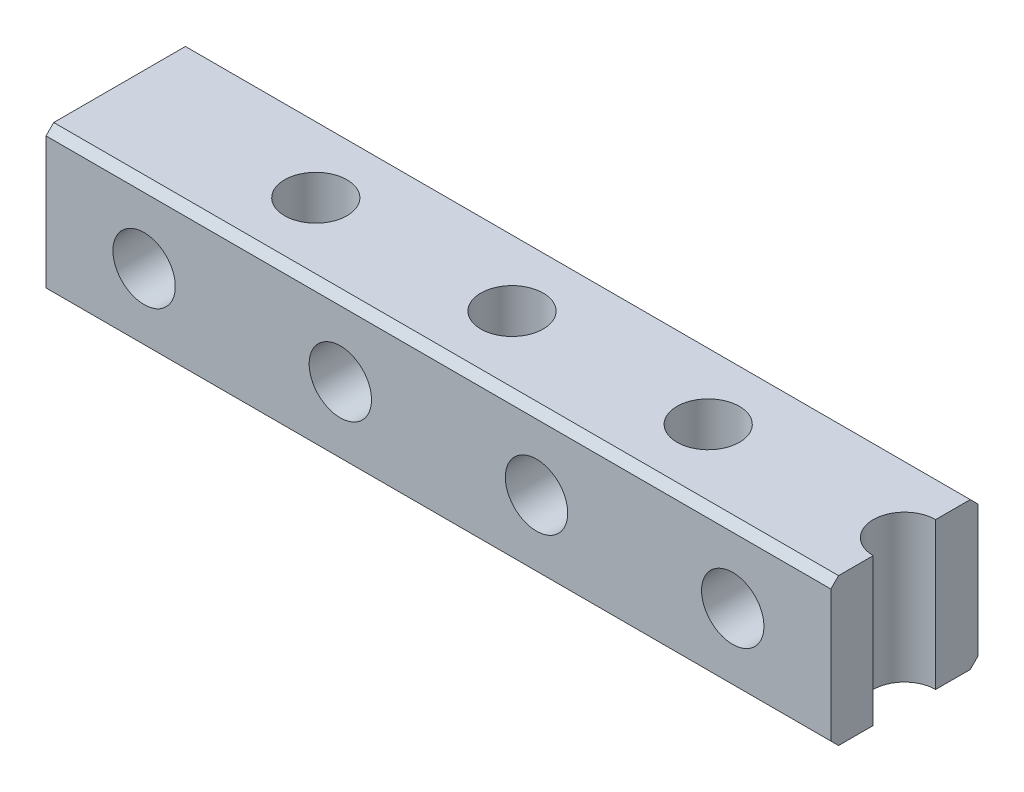
ISO-10303-21;
HEADER;
FILE_DESCRIPTION(('STEP AP214'),'2;1');
FILE_NAME('part.step','',(''),(''),'','','');
FILE_SCHEMA(('AUTOMOTIVE_DESIGN { 1 0 10303 214 1 1 1 1 }'));
ENDSEC;
DATA;
#1=APPLICATION_CONTEXT('core data for automotive mechanical design processes');
#2=APPLICATION_PROTOCOL_DEFINITION('international standard','automotive_design',2000,#1);
#3=PRODUCT_CONTEXT('',#1,'mechanical');
#4=PRODUCT('Part','Part','',(#3));
#5=PRODUCT_RELATED_PRODUCT_CATEGORY('part','',(#4));
#6=PRODUCT_DEFINITION_FORMATION('','',#4);
#7=PRODUCT_DEFINITION_CONTEXT('part definition',#1,'design');
#8=PRODUCT_DEFINITION('design','',#6,#7);
#9=PRODUCT_DEFINITION_SHAPE('','',#8);
#10=(LENGTH_UNIT() NAMED_UNIT(*) SI_UNIT(.MILLI.,.METRE.));
#11=(NAMED_UNIT(*) PLANE_ANGLE_UNIT() SI_UNIT($,.RADIAN.));
#12=(NAMED_UNIT(*) SI_UNIT($,.STERADIAN.) SOLID_ANGLE_UNIT());
#13=UNCERTAINTY_MEASURE_WITH_UNIT(LENGTH_MEASURE(1.E-05),#10,'distance_accuracy_value','');
#14=(GEOMETRIC_REPRESENTATION_CONTEXT(3) GLOBAL_UNCERTAINTY_ASSIGNED_CONTEXT((#13)) GLOBAL_UNIT_ASSIGNED_CONTEXT((#10,
#11,#12)) REPRESENTATION_CONTEXT('',''));
#15=CARTESIAN_POINT('',(0.,0.,0.));
#16=DIRECTION('',(0.,0.,1.));
#17=DIRECTION('',(1.,0.,0.));
#18=AXIS2_PLACEMENT_3D('',#15,#16,#17);
#19=CARTESIAN_POINT('',(25.4,0.,0.));
#20=DIRECTION('',(1.,0.,0.));
#21=DIRECTION('',(0.,1.,0.));
#22=AXIS2_PLACEMENT_3D('',#19,#20,#21);
#23=PLANE('',#22);
#24=DIRECTION('',(0.,1.,0.));
#25=VECTOR('',#24,1.);
#26=CARTESIAN_POINT('',(25.4,-4.7625,2.0193));
#27=LINE('',#26,#25);
#28=CARTESIAN_POINT('',(25.4,4.7625,2.0193));
#29=VERTEX_POINT('',#28);
#30=CARTESIAN_POINT('',(25.4,-4.7625,2.0193));
#31=VERTEX_POINT('',#30);
#32=EDGE_CURVE('E11',#29,#31,#27,.F.);
#33=ORIENTED_EDGE('',*,*,#32,.F.);
#34=DIRECTION('',(0.,0.,-1.));
#35=VECTOR('',#34,1.);
#36=CARTESIAN_POINT('',(25.4,4.7625,-2.13125));
#37=LINE('',#36,#35);
#38=CARTESIAN_POINT('',(25.4,4.7625,4.2625));
#39=VERTEX_POINT('',#38);
#40=EDGE_CURVE('E211',#39,#29,#37,.T.);
#41=ORIENTED_EDGE('',*,*,#40,.F.);
#42=DIRECTION('',(0.,0.707106781186548,-0.707106781186547));
#43=VECTOR('',#42,1.);
#44=CARTESIAN_POINT('',(25.4,4.5125,4.5125));
#45=LINE('',#44,#43);
#46=CARTESIAN_POINT('',(25.4,4.2625,4.7625));
#47=VERTEX_POINT('',#46);
#48=EDGE_CURVE('E207',#47,#39,#45,.T.);
#49=ORIENTED_EDGE('',*,*,#48,.F.);
#50=DIRECTION('',(0.,1.,0.));
#51=VECTOR('',#50,1.);
#52=CARTESIAN_POINT('',(25.4,2.13125,4.7625));
#53=LINE('',#52,#51);
#54=CARTESIAN_POINT('',(25.4,-4.2625,4.7625));
#55=VERTEX_POINT('',#54);
#56=EDGE_CURVE('E203',#55,#47,#53,.T.);
#57=ORIENTED_EDGE('',*,*,#56,.F.);
#58=DIRECTION('',(0.,0.707106781186547,0.707106781186548));
#59=VECTOR('',#58,1.);
#60=CARTESIAN_POINT('',(25.4,-4.5125,4.5125));
#61=LINE('',#60,#59);
#62=CARTESIAN_POINT('',(25.4,-4.7625,4.2625));
#63=VERTEX_POINT('',#62);
#64=EDGE_CURVE('E199',#63,#55,#61,.T.);
#65=ORIENTED_EDGE('',*,*,#64,.F.);
#66=DIRECTION('',(0.,0.,1.));
#67=VECTOR('',#66,1.);
#68=CARTESIAN_POINT('',(25.4,-4.7625,2.13125));
#69=LINE('',#68,#67);
#70=EDGE_CURVE('E198',#31,#63,#69,.T.);
#71=ORIENTED_EDGE('',*,*,#70,.F.);
#72=EDGE_LOOP('',(#33,#41,#49,#57,#65,#71));
#73=FACE_BOUND('',#72,.T.);
#74=ADVANCED_FACE('F17',(#73),#23,.T.);
#75=CARTESIAN_POINT('',(127.,4.5125,-4.5125));
#76=DIRECTION('',(0.,0.707106781186548,-0.707106781186547));
#77=DIRECTION('',(0.,0.707106781186547,0.707106781186548));
#78=AXIS2_PLACEMENT_3D('',#75,#76,#77);
#79=PLANE('',#78);
#80=DIRECTION('',(0.,-0.707106781186547,-0.707106781186548));
#81=VECTOR('',#80,1.);
#82=CARTESIAN_POINT('',(-25.4,4.5125,-4.5125));
#83=LINE('',#82,#81);
#84=CARTESIAN_POINT('',(-25.4,4.7625,-4.2625));
#85=VERTEX_POINT('',#84);
#86=CARTESIAN_POINT('',(-25.4,4.2625,-4.7625));
#87=VERTEX_POINT('',#86);
#88=EDGE_CURVE('E108',#85,#87,#83,.T.);
#89=ORIENTED_EDGE('',*,*,#88,.F.);
#90=DIRECTION('',(-1.,0.,0.));
#91=VECTOR('',#90,1.);
#92=CARTESIAN_POINT('',(127.,4.7625,-4.2625));
#93=LINE('',#92,#91);
#94=CARTESIAN_POINT('',(25.4,4.7625,-4.2625));
#95=VERTEX_POINT('',#94);
#96=EDGE_CURVE('E93',#95,#85,#93,.T.);
#97=ORIENTED_EDGE('',*,*,#96,.F.);
#98=DIRECTION('',(0.,-0.707106781186547,-0.707106781186548));
#99=VECTOR('',#98,1.);
#100=CARTESIAN_POINT('',(25.4,4.5125,-4.5125));
#101=LINE('',#100,#99);
#102=CARTESIAN_POINT('',(25.4,4.2625,-4.7625));
#103=VERTEX_POINT('',#102);
#104=EDGE_CURVE('E147',#95,#103,#101,.T.);
#105=ORIENTED_EDGE('',*,*,#104,.T.);
#106=DIRECTION('',(-1.,0.,0.));
#107=VECTOR('',#106,1.);
#108=CARTESIAN_POINT('',(127.,4.2625,-4.7625));
#109=LINE('',#108,#107);
#110=EDGE_CURVE('E110',#103,#87,#109,.T.);
#111=ORIENTED_EDGE('',*,*,#110,.T.);
#112=EDGE_LOOP('',(#89,#97,#105,#111));
#113=FACE_BOUND('',#112,.T.);
#114=ADVANCED_FACE('F109',(#113),#79,.T.);
#115=CARTESIAN_POINT('',(127.,4.7625,-2.13125));
#116=DIRECTION('',(0.,1.,0.));
#117=DIRECTION('',(0.,0.,1.));
#118=AXIS2_PLACEMENT_3D('',#115,#116,#117);
#119=PLANE('',#118);
#120=CARTESIAN_POINT('',(-12.7,4.7625,0.));
#121=DIRECTION('',(0.,1.,0.));
#122=DIRECTION('',(0.,0.,1.));
#123=AXIS2_PLACEMENT_3D('',#120,#121,#122);
#124=CIRCLE('',#123,2.0193);
#125=CARTESIAN_POINT('',(-12.7,4.7625,2.0193));
#126=VERTEX_POINT('',#125);
#127=EDGE_CURVE('E115',#126,#126,#124,.F.);
#128=ORIENTED_EDGE('',*,*,#127,.T.);
#129=EDGE_LOOP('',(#128));
#130=FACE_BOUND('',#129,.T.);
#131=CARTESIAN_POINT('',(0.,4.7625,0.));
#132=DIRECTION('',(0.,1.,0.));
#133=DIRECTION('',(0.,0.,1.));
#134=AXIS2_PLACEMENT_3D('',#131,#132,#133);
#135=CIRCLE('',#134,2.0193);
#136=CARTESIAN_POINT('',(0.,4.7625,2.0193));
#137=VERTEX_POINT('',#136);
#138=EDGE_CURVE('E268',#137,#137,#135,.F.);
#139=ORIENTED_EDGE('',*,*,#138,.T.);
#140=EDGE_LOOP('',(#139));
#141=FACE_BOUND('',#140,.T.);
#142=CARTESIAN_POINT('',(12.7,4.7625,0.));
#143=DIRECTION('',(0.,1.,0.));
#144=DIRECTION('',(0.,0.,1.));
#145=AXIS2_PLACEMENT_3D('',#142,#143,#144);
#146=CIRCLE('',#145,2.0193);
#147=CARTESIAN_POINT('',(12.7,4.7625,2.0193));
#148=VERTEX_POINT('',#147);
#149=EDGE_CURVE('E264',#148,#148,#146,.F.);
#150=ORIENTED_EDGE('',*,*,#149,.T.);
#151=EDGE_LOOP('',(#150));
#152=FACE_BOUND('',#151,.T.);
#153=DIRECTION('',(0.,0.,-1.));
#154=VECTOR('',#153,1.);
#155=CARTESIAN_POINT('',(-25.4,4.7625,-2.13125));
#156=LINE('',#155,#154);
#157=CARTESIAN_POINT('',(-25.4,4.7625,4.2625));
#158=VERTEX_POINT('',#157);
#159=EDGE_CURVE('E97',#158,#85,#156,.T.);
#160=ORIENTED_EDGE('',*,*,#159,.F.);
#161=DIRECTION('',(-1.,0.,0.));
#162=VECTOR('',#161,1.);
#163=CARTESIAN_POINT('',(127.,4.7625,4.2625));
#164=LINE('',#163,#162);
#165=EDGE_CURVE('E105',#39,#158,#164,.T.);
#166=ORIENTED_EDGE('',*,*,#165,.F.);
#167=ORIENTED_EDGE('',*,*,#40,.T.);
#168=CARTESIAN_POINT('',(25.4,4.7625,0.));
#169=DIRECTION('',(0.,1.,0.));
#170=DIRECTION('',(0.,0.,1.));
#171=AXIS2_PLACEMENT_3D('',#168,#169,#170);
#172=CIRCLE('',#171,2.0193);
#173=CARTESIAN_POINT('',(25.4,4.7625,-2.0193));
#174=VERTEX_POINT('',#173);
#175=EDGE_CURVE('E261',#29,#174,#172,.F.);
#176=ORIENTED_EDGE('',*,*,#175,.T.);
#177=EDGE_CURVE('E100',#174,#95,#37,.T.);
#178=ORIENTED_EDGE('',*,*,#177,.T.);
#179=ORIENTED_EDGE('',*,*,#96,.T.);
#180=EDGE_LOOP('',(#160,#166,#167,#176,#178,#179));
#181=FACE_BOUND('',#180,.T.);
#182=ADVANCED_FACE('F95',(#130,#141,#152,#181),#119,.T.);
#183=CARTESIAN_POINT('',(127.,4.5125,4.5125));
#184=DIRECTION('',(0.,0.707106781186547,0.707106781186548));
#185=DIRECTION('',(0.,-0.707106781186548,0.707106781186547));
#186=AXIS2_PLACEMENT_3D('',#183,#184,#185);
#187=PLANE('',#186);
#188=DIRECTION('',(0.,0.707106781186548,-0.707106781186547));
#189=VECTOR('',#188,1.);
#190=CARTESIAN_POINT('',(-25.4,4.5125,4.5125));
#191=LINE('',#190,#189);
#192=CARTESIAN_POINT('',(-25.4,4.2625,4.7625));
#193=VERTEX_POINT('',#192);
#194=EDGE_CURVE('E120',#193,#158,#191,.T.);
#195=ORIENTED_EDGE('',*,*,#194,.F.);
#196=DIRECTION('',(-1.,0.,0.));
#197=VECTOR('',#196,1.);
#198=CARTESIAN_POINT('',(127.,4.2625,4.7625));
#199=LINE('',#198,#197);
#200=EDGE_CURVE('E162',#47,#193,#199,.T.);
#201=ORIENTED_EDGE('',*,*,#200,.F.);
#202=ORIENTED_EDGE('',*,*,#48,.T.);
#203=ORIENTED_EDGE('',*,*,#165,.T.);
#204=EDGE_LOOP('',(#195,#201,#202,#203));
#205=FACE_BOUND('',#204,.T.);
#206=ADVANCED_FACE('F245',(#205),#187,.T.);
#207=CARTESIAN_POINT('',(127.,2.13125,4.7625));
#208=DIRECTION('',(0.,0.,1.));
#209=DIRECTION('',(1.,0.,0.));
#210=AXIS2_PLACEMENT_3D('',#207,#208,#209);
#211=PLANE('',#210);
#212=CARTESIAN_POINT('',(-19.05,0.,4.7625));
#213=DIRECTION('',(0.,0.,-1.));
#214=DIRECTION('',(-1.,0.,0.));
#215=AXIS2_PLACEMENT_3D('',#212,#213,#214);
#216=CIRCLE('',#215,2.0193);
#217=CARTESIAN_POINT('',(-21.0693,0.,4.7625));
#218=VERTEX_POINT('',#217);
#219=EDGE_CURVE('E172',#218,#218,#216,.T.);
#220=ORIENTED_EDGE('',*,*,#219,.T.);
#221=EDGE_LOOP('',(#220));
#222=FACE_BOUND('',#221,.T.);
#223=CARTESIAN_POINT('',(-6.35,0.,4.7625));
#224=DIRECTION('',(0.,0.,-1.));
#225=DIRECTION('',(-1.,0.,0.));
#226=AXIS2_PLACEMENT_3D('',#223,#224,#225);
#227=CIRCLE('',#226,2.0193);
#228=CARTESIAN_POINT('',(-8.3693,0.,4.7625));
#229=VERTEX_POINT('',#228);
#230=EDGE_CURVE('E295',#229,#229,#227,.T.);
#231=ORIENTED_EDGE('',*,*,#230,.T.);
#232=EDGE_LOOP('',(#231));
#233=FACE_BOUND('',#232,.T.);
#234=CARTESIAN_POINT('',(6.35,0.,4.7625));
#235=DIRECTION('',(0.,0.,-1.));
#236=DIRECTION('',(-1.,0.,0.));
#237=AXIS2_PLACEMENT_3D('',#234,#235,#236);
#238=CIRCLE('',#237,2.0193);
#239=CARTESIAN_POINT('',(4.3307,0.,4.7625));
#240=VERTEX_POINT('',#239);
#241=EDGE_CURVE('E291',#240,#240,#238,.T.);
#242=ORIENTED_EDGE('',*,*,#241,.T.);
#243=EDGE_LOOP('',(#242));
#244=FACE_BOUND('',#243,.T.);
#245=CARTESIAN_POINT('',(19.05,0.,4.7625));
#246=DIRECTION('',(0.,0.,-1.));
#247=DIRECTION('',(-1.,0.,0.));
#248=AXIS2_PLACEMENT_3D('',#245,#246,#247);
#249=CIRCLE('',#248,2.0193);
#250=CARTESIAN_POINT('',(17.0307,0.,4.7625));
#251=VERTEX_POINT('',#250);
#252=EDGE_CURVE('E288',#251,#251,#249,.T.);
#253=ORIENTED_EDGE('',*,*,#252,.T.);
#254=EDGE_LOOP('',(#253));
#255=FACE_BOUND('',#254,.T.);
#256=DIRECTION('',(0.,1.,0.));
#257=VECTOR('',#256,1.);
#258=CARTESIAN_POINT('',(-25.4,2.13125,4.7625));
#259=LINE('',#258,#257);
#260=CARTESIAN_POINT('',(-25.4,-4.2625,4.7625));
#261=VERTEX_POINT('',#260);
#262=EDGE_CURVE('E126',#261,#193,#259,.T.);
#263=ORIENTED_EDGE('',*,*,#262,.F.);
#264=DIRECTION('',(-1.,0.,0.));
#265=VECTOR('',#264,1.);
#266=CARTESIAN_POINT('',(127.,-4.2625,4.7625));
#267=LINE('',#266,#265);
#268=EDGE_CURVE('E160',#55,#261,#267,.T.);
#269=ORIENTED_EDGE('',*,*,#268,.F.);
#270=ORIENTED_EDGE('',*,*,#56,.T.);
#271=ORIENTED_EDGE('',*,*,#200,.T.);
#272=EDGE_LOOP('',(#263,#269,#270,#271));
#273=FACE_BOUND('',#272,.T.);
#274=ADVANCED_FACE('F242',(#222,#233,#244,#255,#273),#211,.T.);
#275=CARTESIAN_POINT('',(127.,-4.5125,4.5125));
#276=DIRECTION('',(0.,-0.707106781186548,0.707106781186547));
#277=DIRECTION('',(0.,-0.707106781186547,-0.707106781186548));
#278=AXIS2_PLACEMENT_3D('',#275,#276,#277);
#279=PLANE('',#278);
#280=DIRECTION('',(0.,0.707106781186547,0.707106781186548));
#281=VECTOR('',#280,1.);
#282=CARTESIAN_POINT('',(-25.4,-4.5125,4.5125));
#283=LINE('',#282,#281);
#284=CARTESIAN_POINT('',(-25.4,-4.7625,4.2625));
#285=VERTEX_POINT('',#284);
#286=EDGE_CURVE('E132',#285,#261,#283,.T.);
#287=ORIENTED_EDGE('',*,*,#286,.F.);
#288=DIRECTION('',(-1.,0.,0.));
#289=VECTOR('',#288,1.);
#290=CARTESIAN_POINT('',(127.,-4.7625,4.2625));
#291=LINE('',#290,#289);
#292=EDGE_CURVE('E157',#63,#285,#291,.T.);
#293=ORIENTED_EDGE('',*,*,#292,.F.);
#294=ORIENTED_EDGE('',*,*,#64,.T.);
#295=ORIENTED_EDGE('',*,*,#268,.T.);
#296=EDGE_LOOP('',(#287,#293,#294,#295));
#297=FACE_BOUND('',#296,.T.);
#298=ADVANCED_FACE('F238',(#297),#279,.T.);
#299=CARTESIAN_POINT('',(127.,-4.7625,2.13125));
#300=DIRECTION('',(0.,-1.,0.));
#301=DIRECTION('',(0.,0.,-1.));
#302=AXIS2_PLACEMENT_3D('',#299,#300,#301);
#303=PLANE('',#302);
#304=CARTESIAN_POINT('',(-12.7,-4.7625,0.));
#305=DIRECTION('',(0.,1.,0.));
#306=DIRECTION('',(0.,0.,1.));
#307=AXIS2_PLACEMENT_3D('',#304,#305,#306);
#308=CIRCLE('',#307,2.0193);
#309=CARTESIAN_POINT('',(-12.7,-4.7625,2.0193));
#310=VERTEX_POINT('',#309);
#311=EDGE_CURVE('E257',#310,#310,#308,.T.);
#312=ORIENTED_EDGE('',*,*,#311,.T.);
#313=EDGE_LOOP('',(#312));
#314=FACE_BOUND('',#313,.T.);
#315=CARTESIAN_POINT('',(0.,-4.7625,0.));
#316=DIRECTION('',(0.,1.,0.));
#317=DIRECTION('',(0.,0.,1.));
#318=AXIS2_PLACEMENT_3D('',#315,#316,#317);
#319=CIRCLE('',#318,2.0193);
#320=CARTESIAN_POINT('',(0.,-4.7625,2.0193));
#321=VERTEX_POINT('',#320);
#322=EDGE_CURVE('E250',#321,#321,#319,.T.);
#323=ORIENTED_EDGE('',*,*,#322,.T.);
#324=EDGE_LOOP('',(#323));
#325=FACE_BOUND('',#324,.T.);
#326=CARTESIAN_POINT('',(12.7,-4.7625,0.));
#327=DIRECTION('',(0.,1.,0.));
#328=DIRECTION('',(0.,0.,1.));
#329=AXIS2_PLACEMENT_3D('',#326,#327,#328);
#330=CIRCLE('',#329,2.0193);
#331=CARTESIAN_POINT('',(12.7,-4.7625,2.0193));
#332=VERTEX_POINT('',#331);
#333=EDGE_CURVE('E224',#332,#332,#330,.T.);
#334=ORIENTED_EDGE('',*,*,#333,.T.);
#335=EDGE_LOOP('',(#334));
#336=FACE_BOUND('',#335,.T.);
#337=DIRECTION('',(0.,0.,1.));
#338=VECTOR('',#337,1.);
#339=CARTESIAN_POINT('',(-25.4,-4.7625,2.13125));
#340=LINE('',#339,#338);
#341=CARTESIAN_POINT('',(-25.4,-4.7625,-4.2625));
#342=VERTEX_POINT('',#341);
#343=EDGE_CURVE('E136',#342,#285,#340,.T.);
#344=ORIENTED_EDGE('',*,*,#343,.F.);
#345=DIRECTION('',(-1.,0.,0.));
#346=VECTOR('',#345,1.);
#347=CARTESIAN_POINT('',(127.,-4.7625,-4.2625));
#348=LINE('',#347,#346);
#349=CARTESIAN_POINT('',(25.4,-4.7625,-4.2625));
#350=VERTEX_POINT('',#349);
#351=EDGE_CURVE('E154',#350,#342,#348,.T.);
#352=ORIENTED_EDGE('',*,*,#351,.F.);
#353=CARTESIAN_POINT('',(25.4,-4.7625,-2.0193));
#354=VERTEX_POINT('',#353);
#355=EDGE_CURVE('E194',#350,#354,#69,.T.);
#356=ORIENTED_EDGE('',*,*,#355,.T.);
#357=CARTESIAN_POINT('',(25.4,-4.7625,0.));
#358=DIRECTION('',(0.,1.,0.));
#359=DIRECTION('',(0.,0.,1.));
#360=AXIS2_PLACEMENT_3D('',#357,#358,#359);
#361=CIRCLE('',#360,2.0193);
#362=EDGE_CURVE('E184',#354,#31,#361,.T.);
#363=ORIENTED_EDGE('',*,*,#362,.T.);
#364=ORIENTED_EDGE('',*,*,#70,.T.);
#365=ORIENTED_EDGE('',*,*,#292,.T.);
#366=EDGE_LOOP('',(#344,#352,#356,#363,#364,#365));
#367=FACE_BOUND('',#366,.T.);
#368=ADVANCED_FACE('F227',(#314,#325,#336,#367),#303,.T.);
#369=CARTESIAN_POINT('',(127.,-4.5125,-4.5125));
#370=DIRECTION('',(0.,-0.707106781186547,-0.707106781186548));
#371=DIRECTION('',(0.,0.707106781186548,-0.707106781186547));
#372=AXIS2_PLACEMENT_3D('',#369,#370,#371);
#373=PLANE('',#372);
#374=DIRECTION('',(0.,-0.707106781186548,0.707106781186547));
#375=VECTOR('',#374,1.);
#376=CARTESIAN_POINT('',(-25.4,-4.5125,-4.5125));
#377=LINE('',#376,#375);
#378=CARTESIAN_POINT('',(-25.4,-4.2625,-4.7625));
#379=VERTEX_POINT('',#378);
#380=EDGE_CURVE('E140',#379,#342,#377,.T.);
#381=ORIENTED_EDGE('',*,*,#380,.F.);
#382=DIRECTION('',(-1.,0.,0.));
#383=VECTOR('',#382,1.);
#384=CARTESIAN_POINT('',(127.,-4.2625,-4.7625));
#385=LINE('',#384,#383);
#386=CARTESIAN_POINT('',(25.4,-4.2625,-4.7625));
#387=VERTEX_POINT('',#386);
#388=EDGE_CURVE('E150',#387,#379,#385,.T.);
#389=ORIENTED_EDGE('',*,*,#388,.F.);
#390=DIRECTION('',(0.,-0.707106781186548,0.707106781186547));
#391=VECTOR('',#390,1.);
#392=CARTESIAN_POINT('',(25.4,-4.5125,-4.5125));
#393=LINE('',#392,#391);
#394=EDGE_CURVE('E190',#387,#350,#393,.T.);
#395=ORIENTED_EDGE('',*,*,#394,.T.);
#396=ORIENTED_EDGE('',*,*,#351,.T.);
#397=EDGE_LOOP('',(#381,#389,#395,#396));
#398=FACE_BOUND('',#397,.T.);
#399=ADVANCED_FACE('F230',(#398),#373,.T.);
#400=CARTESIAN_POINT('',(127.,-2.13125,-4.7625));
#401=DIRECTION('',(0.,0.,-1.));
#402=DIRECTION('',(-1.,0.,0.));
#403=AXIS2_PLACEMENT_3D('',#400,#401,#402);
#404=PLANE('',#403);
#405=CARTESIAN_POINT('',(-19.05,0.,-4.7625));
#406=DIRECTION('',(0.,0.,-1.));
#407=DIRECTION('',(-1.,0.,0.));
#408=AXIS2_PLACEMENT_3D('',#405,#406,#407);
#409=CIRCLE('',#408,2.0193);
#410=CARTESIAN_POINT('',(-21.0693,0.,-4.7625));
#411=VERTEX_POINT('',#410);
#412=EDGE_CURVE('E180',#411,#411,#409,.F.);
#413=ORIENTED_EDGE('',*,*,#412,.T.);
#414=EDGE_LOOP('',(#413));
#415=FACE_BOUND('',#414,.T.);
#416=CARTESIAN_POINT('',(-6.35,0.,-4.7625));
#417=DIRECTION('',(0.,0.,-1.));
#418=DIRECTION('',(-1.,0.,0.));
#419=AXIS2_PLACEMENT_3D('',#416,#417,#418);
#420=CIRCLE('',#419,2.0193);
#421=CARTESIAN_POINT('',(-8.3693,0.,-4.7625));
#422=VERTEX_POINT('',#421);
#423=EDGE_CURVE('E176',#422,#422,#420,.F.);
#424=ORIENTED_EDGE('',*,*,#423,.T.);
#425=EDGE_LOOP('',(#424));
#426=FACE_BOUND('',#425,.T.);
#427=CARTESIAN_POINT('',(6.35,0.,-4.7625));
#428=DIRECTION('',(0.,0.,-1.));
#429=DIRECTION('',(-1.,0.,0.));
#430=AXIS2_PLACEMENT_3D('',#427,#428,#429);
#431=CIRCLE('',#430,2.0193);
#432=CARTESIAN_POINT('',(4.3307,0.,-4.7625));
#433=VERTEX_POINT('',#432);
#434=EDGE_CURVE('E171',#433,#433,#431,.F.);
#435=ORIENTED_EDGE('',*,*,#434,.T.);
#436=EDGE_LOOP('',(#435));
#437=FACE_BOUND('',#436,.T.);
#438=CARTESIAN_POINT('',(19.05,0.,-4.7625));
#439=DIRECTION('',(0.,0.,-1.));
#440=DIRECTION('',(-1.,0.,0.));
#441=AXIS2_PLACEMENT_3D('',#438,#439,#440);
#442=CIRCLE('',#441,2.0193);
#443=CARTESIAN_POINT('',(17.0307,0.,-4.7625));
#444=VERTEX_POINT('',#443);
#445=EDGE_CURVE('E167',#444,#444,#442,.F.);
#446=ORIENTED_EDGE('',*,*,#445,.T.);
#447=EDGE_LOOP('',(#446));
#448=FACE_BOUND('',#447,.T.);
#449=DIRECTION('',(0.,-1.,0.));
#450=VECTOR('',#449,1.);
#451=CARTESIAN_POINT('',(-25.4,-2.13125,-4.7625));
#452=LINE('',#451,#450);
#453=EDGE_CURVE('E144',#87,#379,#452,.T.);
#454=ORIENTED_EDGE('',*,*,#453,.F.);
#455=ORIENTED_EDGE('',*,*,#110,.F.);
#456=DIRECTION('',(0.,-1.,0.));
#457=VECTOR('',#456,1.);
#458=CARTESIAN_POINT('',(25.4,-2.13125,-4.7625));
#459=LINE('',#458,#457);
#460=EDGE_CURVE('E151',#103,#387,#459,.T.);
#461=ORIENTED_EDGE('',*,*,#460,.T.);
#462=ORIENTED_EDGE('',*,*,#388,.T.);
#463=EDGE_LOOP('',(#454,#455,#461,#462));
#464=FACE_BOUND('',#463,.T.);
#465=ADVANCED_FACE('F233',(#415,#426,#437,#448,#464),#404,.T.);
#466=ORIENTED_EDGE('',*,*,#177,.F.);
#467=DIRECTION('',(0.,1.,0.));
#468=VECTOR('',#467,1.);
#469=CARTESIAN_POINT('',(25.4,-4.7625,-2.0193));
#470=LINE('',#469,#468);
#471=EDGE_CURVE('E26',#174,#354,#470,.F.);
#472=ORIENTED_EDGE('',*,*,#471,.T.);
#473=ORIENTED_EDGE('',*,*,#355,.F.);
#474=ORIENTED_EDGE('',*,*,#394,.F.);
#475=ORIENTED_EDGE('',*,*,#460,.F.);
#476=ORIENTED_EDGE('',*,*,#104,.F.);
#477=EDGE_LOOP('',(#466,#472,#473,#474,#475,#476));
#478=FACE_BOUND('',#477,.T.);
#479=ADVANCED_FACE('F19',(#478),#23,.T.);
#480=CARTESIAN_POINT('',(-25.4,0.,0.));
#481=DIRECTION('',(1.,0.,0.));
#482=DIRECTION('',(0.,1.,0.));
#483=AXIS2_PLACEMENT_3D('',#480,#481,#482);
#484=PLANE('',#483);
#485=ORIENTED_EDGE('',*,*,#88,.T.);
#486=ORIENTED_EDGE('',*,*,#453,.T.);
#487=ORIENTED_EDGE('',*,*,#380,.T.);
#488=ORIENTED_EDGE('',*,*,#343,.T.);
#489=ORIENTED_EDGE('',*,*,#286,.T.);
#490=ORIENTED_EDGE('',*,*,#262,.T.);
#491=ORIENTED_EDGE('',*,*,#194,.T.);
#492=ORIENTED_EDGE('',*,*,#159,.T.);
#493=EDGE_LOOP('',(#485,#486,#487,#488,#489,#490,#491,#492));
#494=FACE_BOUND('',#493,.T.);
#495=ADVANCED_FACE('F117',(#494),#484,.F.);
#496=CARTESIAN_POINT('',(25.4,-4.7625,0.));
#497=DIRECTION('',(0.,1.,0.));
#498=DIRECTION('',(0.,0.,1.));
#499=AXIS2_PLACEMENT_3D('',#496,#497,#498);
#500=CYLINDRICAL_SURFACE('',#499,2.0193);
#501=ORIENTED_EDGE('',*,*,#175,.F.);
#502=ORIENTED_EDGE('',*,*,#32,.T.);
#503=ORIENTED_EDGE('',*,*,#362,.F.);
#504=ORIENTED_EDGE('',*,*,#471,.F.);
#505=EDGE_LOOP('',(#501,#502,#503,#504));
#506=FACE_BOUND('',#505,.T.);
#507=ADVANCED_FACE('F221',(#506),#500,.F.);
#508=CARTESIAN_POINT('',(12.7,-4.7625,0.));
#509=DIRECTION('',(0.,1.,0.));
#510=DIRECTION('',(0.,0.,1.));
#511=AXIS2_PLACEMENT_3D('',#508,#509,#510);
#512=CYLINDRICAL_SURFACE('',#511,2.0193);
#513=ORIENTED_EDGE('',*,*,#149,.F.);
#514=EDGE_LOOP('',(#513));
#515=FACE_BOUND('',#514,.T.);
#516=ORIENTED_EDGE('',*,*,#333,.F.);
#517=EDGE_LOOP('',(#516));
#518=FACE_BOUND('',#517,.T.);
#519=ADVANCED_FACE('F387',(#515,#518),#512,.F.);
#520=CARTESIAN_POINT('',(0.,-4.7625,0.));
#521=DIRECTION('',(0.,1.,0.));
#522=DIRECTION('',(0.,0.,1.));
#523=AXIS2_PLACEMENT_3D('',#520,#521,#522);
#524=CYLINDRICAL_SURFACE('',#523,2.0193);
#525=ORIENTED_EDGE('',*,*,#138,.F.);
#526=EDGE_LOOP('',(#525));
#527=FACE_BOUND('',#526,.T.);
#528=ORIENTED_EDGE('',*,*,#322,.F.);
#529=EDGE_LOOP('',(#528));
#530=FACE_BOUND('',#529,.T.);
#531=ADVANCED_FACE('F281',(#527,#530),#524,.F.);
#532=CARTESIAN_POINT('',(-12.7,-4.7625,0.));
#533=DIRECTION('',(0.,1.,0.));
#534=DIRECTION('',(0.,0.,1.));
#535=AXIS2_PLACEMENT_3D('',#532,#533,#534);
#536=CYLINDRICAL_SURFACE('',#535,2.0193);
#537=ORIENTED_EDGE('',*,*,#127,.F.);
#538=EDGE_LOOP('',(#537));
#539=FACE_BOUND('',#538,.T.);
#540=ORIENTED_EDGE('',*,*,#311,.F.);
#541=EDGE_LOOP('',(#540));
#542=FACE_BOUND('',#541,.T.);
#543=ADVANCED_FACE('F277',(#539,#542),#536,.F.);
#544=CARTESIAN_POINT('',(19.05,0.,4.7625));
#545=DIRECTION('',(0.,0.,-1.));
#546=DIRECTION('',(-1.,0.,0.));
#547=AXIS2_PLACEMENT_3D('',#544,#545,#546);
#548=CYLINDRICAL_SURFACE('',#547,2.0193);
#549=ORIENTED_EDGE('',*,*,#445,.F.);
#550=EDGE_LOOP('',(#549));
#551=FACE_BOUND('',#550,.T.);
#552=ORIENTED_EDGE('',*,*,#252,.F.);
#553=EDGE_LOOP('',(#552));
#554=FACE_BOUND('',#553,.T.);
#555=ADVANCED_FACE('F280',(#551,#554),#548,.F.);
#556=CARTESIAN_POINT('',(6.35,0.,4.7625));
#557=DIRECTION('',(0.,0.,-1.));
#558=DIRECTION('',(-1.,0.,0.));
#559=AXIS2_PLACEMENT_3D('',#556,#557,#558);
#560=CYLINDRICAL_SURFACE('',#559,2.0193);
#561=ORIENTED_EDGE('',*,*,#434,.F.);
#562=EDGE_LOOP('',(#561));
#563=FACE_BOUND('',#562,.T.);
#564=ORIENTED_EDGE('',*,*,#241,.F.);
#565=EDGE_LOOP('',(#564));
#566=FACE_BOUND('',#565,.T.);
#567=ADVANCED_FACE('F313',(#563,#566),#560,.F.);
#568=CARTESIAN_POINT('',(-6.35,0.,4.7625));
#569=DIRECTION('',(0.,0.,-1.));
#570=DIRECTION('',(-1.,0.,0.));
#571=AXIS2_PLACEMENT_3D('',#568,#569,#570);
#572=CYLINDRICAL_SURFACE('',#571,2.0193);
#573=ORIENTED_EDGE('',*,*,#423,.F.);
#574=EDGE_LOOP('',(#573));
#575=FACE_BOUND('',#574,.T.);
#576=ORIENTED_EDGE('',*,*,#230,.F.);
#577=EDGE_LOOP('',(#576));
#578=FACE_BOUND('',#577,.T.);
#579=ADVANCED_FACE('F307',(#575,#578),#572,.F.);
#580=CARTESIAN_POINT('',(-19.05,0.,4.7625));
#581=DIRECTION('',(0.,0.,-1.));
#582=DIRECTION('',(-1.,0.,0.));
#583=AXIS2_PLACEMENT_3D('',#580,#581,#582);
#584=CYLINDRICAL_SURFACE('',#583,2.0193);
#585=ORIENTED_EDGE('',*,*,#412,.F.);
#586=EDGE_LOOP('',(#585));
#587=FACE_BOUND('',#586,.T.);
#588=ORIENTED_EDGE('',*,*,#219,.F.);
#589=EDGE_LOOP('',(#588));
#590=FACE_BOUND('',#589,.T.);
#591=ADVANCED_FACE('F305',(#587,#590),#584,.F.);
#592=CLOSED_SHELL('',(#74,#114,#182,#206,#274,#298,#368,#399,#465,#479,#495,#507,#519,#531,#543,
#555,#567,#579,#591));
#593=MANIFOLD_SOLID_BREP('B1',#592);
#594=ADVANCED_BREP_SHAPE_REPRESENTATION('',(#18,#593),#14);
#595=SHAPE_DEFINITION_REPRESENTATION(#9,#594);
ENDSEC;
END-ISO-10303-21;
